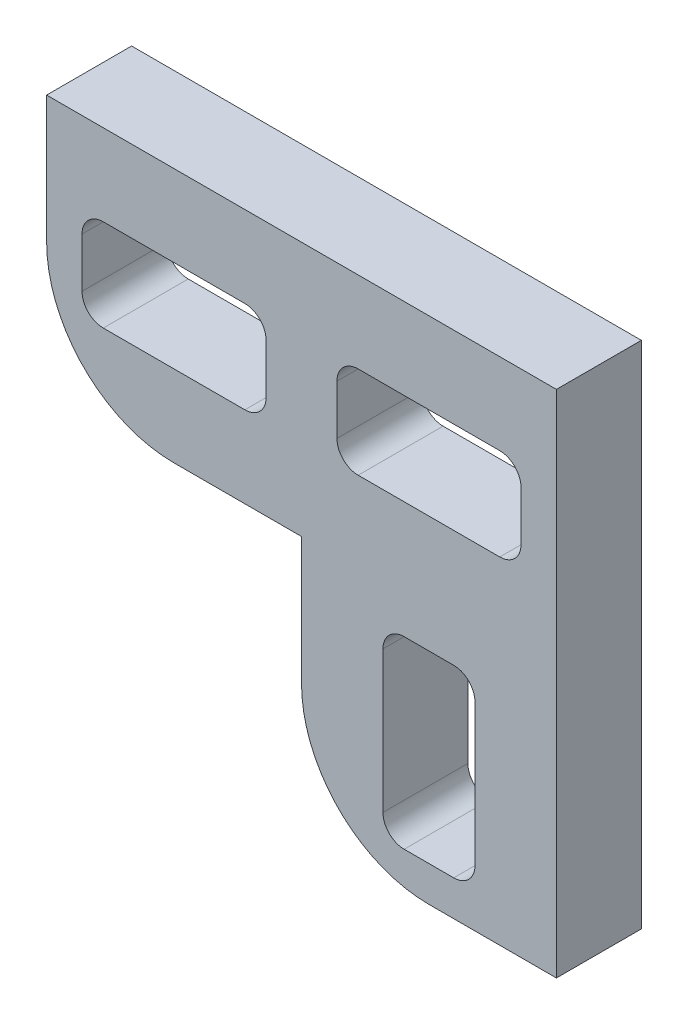
ISO-10303-21;
HEADER;
FILE_DESCRIPTION(('STEP AP214'),'2;1');
FILE_NAME('part.step','',(''),(''),'','','');
FILE_SCHEMA(('AUTOMOTIVE_DESIGN { 1 0 10303 214 1 1 1 1 }'));
ENDSEC;
DATA;
#1=APPLICATION_CONTEXT('core data for automotive mechanical design processes');
#2=APPLICATION_PROTOCOL_DEFINITION('international standard','automotive_design',2000,#1);
#3=PRODUCT_CONTEXT('',#1,'mechanical');
#4=PRODUCT('Part','Part','',(#3));
#5=PRODUCT_RELATED_PRODUCT_CATEGORY('part','',(#4));
#6=PRODUCT_DEFINITION_FORMATION('','',#4);
#7=PRODUCT_DEFINITION_CONTEXT('part definition',#1,'design');
#8=PRODUCT_DEFINITION('design','',#6,#7);
#9=PRODUCT_DEFINITION_SHAPE('','',#8);
#10=(LENGTH_UNIT() NAMED_UNIT(*) SI_UNIT(.MILLI.,.METRE.));
#11=(NAMED_UNIT(*) PLANE_ANGLE_UNIT() SI_UNIT($,.RADIAN.));
#12=(NAMED_UNIT(*) SI_UNIT($,.STERADIAN.) SOLID_ANGLE_UNIT());
#13=UNCERTAINTY_MEASURE_WITH_UNIT(LENGTH_MEASURE(1.E-05),#10,'distance_accuracy_value','');
#14=(GEOMETRIC_REPRESENTATION_CONTEXT(3) GLOBAL_UNCERTAINTY_ASSIGNED_CONTEXT((#13)) GLOBAL_UNIT_ASSIGNED_CONTEXT((#10,
#11,#12)) REPRESENTATION_CONTEXT('',''));
#15=CARTESIAN_POINT('',(0.,0.,0.));
#16=DIRECTION('',(0.,0.,1.));
#17=DIRECTION('',(1.,0.,0.));
#18=AXIS2_PLACEMENT_3D('',#15,#16,#17);
#19=CARTESIAN_POINT('',(149.3421335095,207.323953209,3.));
#20=DIRECTION('',(0.,0.,1.));
#21=DIRECTION('',(1.,0.,0.));
#22=AXIS2_PLACEMENT_3D('',#19,#20,#21);
#23=PLANE('',#22);
#24=DIRECTION('',(1.,0.,0.));
#25=VECTOR('',#24,1.);
#26=CARTESIAN_POINT('',(151.8421335095,205.698953209,3.));
#27=LINE('',#26,#25);
#28=CARTESIAN_POINT('',(146.8421335095,205.698953209,3.));
#29=VERTEX_POINT('',#28);
#30=CARTESIAN_POINT('',(151.8421335095,205.698953209,3.));
#31=VERTEX_POINT('',#30);
#32=EDGE_CURVE('E309',#29,#31,#27,.T.);
#33=ORIENTED_EDGE('',*,*,#32,.F.);
#34=CARTESIAN_POINT('',(146.8421335095,206.448953209,3.));
#35=DIRECTION('',(0.,0.,1.));
#36=DIRECTION('',(1.,0.,0.));
#37=AXIS2_PLACEMENT_3D('',#34,#35,#36);
#38=CIRCLE('',#37,0.750000000000001);
#39=CARTESIAN_POINT('',(146.0921335095,206.448953209,3.));
#40=VERTEX_POINT('',#39);
#41=EDGE_CURVE('E307',#40,#29,#38,.T.);
#42=ORIENTED_EDGE('',*,*,#41,.F.);
#43=DIRECTION('',(0.,-1.,0.));
#44=VECTOR('',#43,1.);
#45=CARTESIAN_POINT('',(146.0921335095,206.448953209,3.));
#46=LINE('',#45,#44);
#47=CARTESIAN_POINT('',(146.0921335095,208.198953209,3.));
#48=VERTEX_POINT('',#47);
#49=EDGE_CURVE('E323',#48,#40,#46,.T.);
#50=ORIENTED_EDGE('',*,*,#49,.F.);
#51=CARTESIAN_POINT('',(146.8421335095,208.198953209,3.));
#52=DIRECTION('',(0.,0.,1.));
#53=DIRECTION('',(1.,0.,0.));
#54=AXIS2_PLACEMENT_3D('',#51,#52,#53);
#55=CIRCLE('',#54,0.750000000000001);
#56=CARTESIAN_POINT('',(146.8421335095,208.948953209,3.));
#57=VERTEX_POINT('',#56);
#58=EDGE_CURVE('E320',#57,#48,#55,.T.);
#59=ORIENTED_EDGE('',*,*,#58,.F.);
#60=DIRECTION('',(-1.,0.,0.));
#61=VECTOR('',#60,1.);
#62=CARTESIAN_POINT('',(146.8421335095,208.948953209,3.));
#63=LINE('',#62,#61);
#64=CARTESIAN_POINT('',(151.8421335095,208.948953209,3.));
#65=VERTEX_POINT('',#64);
#66=EDGE_CURVE('E318',#65,#57,#63,.T.);
#67=ORIENTED_EDGE('',*,*,#66,.F.);
#68=CARTESIAN_POINT('',(151.8421335095,208.198953209,3.));
#69=DIRECTION('',(0.,0.,1.));
#70=DIRECTION('',(1.,0.,0.));
#71=AXIS2_PLACEMENT_3D('',#68,#69,#70);
#72=CIRCLE('',#71,0.750000000000001);
#73=CARTESIAN_POINT('',(152.5921335095,208.198953209,3.));
#74=VERTEX_POINT('',#73);
#75=EDGE_CURVE('E316',#74,#65,#72,.T.);
#76=ORIENTED_EDGE('',*,*,#75,.F.);
#77=DIRECTION('',(0.,1.,0.));
#78=VECTOR('',#77,1.);
#79=CARTESIAN_POINT('',(152.5921335095,208.198953209,3.));
#80=LINE('',#79,#78);
#81=CARTESIAN_POINT('',(152.5921335095,206.448953209,3.));
#82=VERTEX_POINT('',#81);
#83=EDGE_CURVE('E314',#82,#74,#80,.T.);
#84=ORIENTED_EDGE('',*,*,#83,.F.);
#85=CARTESIAN_POINT('',(151.8421335095,206.448953209,3.));
#86=DIRECTION('',(0.,0.,1.));
#87=DIRECTION('',(1.,0.,0.));
#88=AXIS2_PLACEMENT_3D('',#85,#86,#87);
#89=CIRCLE('',#88,0.750000000000001);
#90=EDGE_CURVE('E312',#31,#82,#89,.T.);
#91=ORIENTED_EDGE('',*,*,#90,.F.);
#92=EDGE_LOOP('',(#33,#42,#50,#59,#67,#76,#84,#91));
#93=FACE_BOUND('',#92,.T.);
#94=CARTESIAN_POINT('',(149.3421335095,207.323953209,3.));
#95=DIRECTION('',(0.,0.,1.));
#96=DIRECTION('',(1.,0.,0.));
#97=AXIS2_PLACEMENT_3D('',#94,#95,#96);
#98=CIRCLE('',#97,4.49999999999999);
#99=CARTESIAN_POINT('',(144.8421335095,207.323953209,3.));
#100=VERTEX_POINT('',#99);
#101=CARTESIAN_POINT('',(149.3421335095,202.823953209,3.));
#102=VERTEX_POINT('',#101);
#103=EDGE_CURVE('E425',#100,#102,#98,.T.);
#104=ORIENTED_EDGE('',*,*,#103,.T.);
#105=DIRECTION('',(1.,0.,0.));
#106=VECTOR('',#105,1.);
#107=CARTESIAN_POINT('',(153.8421335095,202.823953209,3.));
#108=LINE('',#107,#106);
#109=CARTESIAN_POINT('',(153.8421335095,202.823953209,3.));
#110=VERTEX_POINT('',#109);
#111=EDGE_CURVE('E428',#102,#110,#108,.T.);
#112=ORIENTED_EDGE('',*,*,#111,.T.);
#113=DIRECTION('',(0.,-1.,0.));
#114=VECTOR('',#113,1.);
#115=CARTESIAN_POINT('',(153.8421335095,198.323953209,3.));
#116=LINE('',#115,#114);
#117=CARTESIAN_POINT('',(153.8421335095,198.323953209,3.));
#118=VERTEX_POINT('',#117);
#119=EDGE_CURVE('E431',#110,#118,#116,.T.);
#120=ORIENTED_EDGE('',*,*,#119,.T.);
#121=CARTESIAN_POINT('',(158.3421335095,198.323953209,3.));
#122=DIRECTION('',(0.,0.,1.));
#123=DIRECTION('',(1.,0.,0.));
#124=AXIS2_PLACEMENT_3D('',#121,#122,#123);
#125=CIRCLE('',#124,4.49999999999999);
#126=CARTESIAN_POINT('',(158.3421335095,193.823953209,3.));
#127=VERTEX_POINT('',#126);
#128=EDGE_CURVE('E433',#118,#127,#125,.T.);
#129=ORIENTED_EDGE('',*,*,#128,.T.);
#130=DIRECTION('',(1.,0.,0.));
#131=VECTOR('',#130,1.);
#132=CARTESIAN_POINT('',(158.3421335095,193.823953209,3.));
#133=LINE('',#132,#131);
#134=CARTESIAN_POINT('',(162.8421335095,193.823953209,3.));
#135=VERTEX_POINT('',#134);
#136=EDGE_CURVE('E435',#127,#135,#133,.T.);
#137=ORIENTED_EDGE('',*,*,#136,.T.);
#138=DIRECTION('',(0.,1.,0.));
#139=VECTOR('',#138,1.);
#140=CARTESIAN_POINT('',(162.8421335095,198.323953209,3.));
#141=LINE('',#140,#139);
#142=CARTESIAN_POINT('',(162.8421335095,211.823953209,3.));
#143=VERTEX_POINT('',#142);
#144=EDGE_CURVE('E437',#135,#143,#141,.T.);
#145=ORIENTED_EDGE('',*,*,#144,.T.);
#146=DIRECTION('',(-1.,0.,0.));
#147=VECTOR('',#146,1.);
#148=CARTESIAN_POINT('',(158.3421335095,211.823953209,3.));
#149=LINE('',#148,#147);
#150=CARTESIAN_POINT('',(144.8421335095,211.823953209,3.));
#151=VERTEX_POINT('',#150);
#152=EDGE_CURVE('E439',#143,#151,#149,.T.);
#153=ORIENTED_EDGE('',*,*,#152,.T.);
#154=DIRECTION('',(0.,-1.,0.));
#155=VECTOR('',#154,1.);
#156=CARTESIAN_POINT('',(144.8421335095,207.323953209,3.));
#157=LINE('',#156,#155);
#158=EDGE_CURVE('E441',#151,#100,#157,.T.);
#159=ORIENTED_EDGE('',*,*,#158,.T.);
#160=EDGE_LOOP('',(#104,#112,#120,#129,#137,#145,#153,#159));
#161=FACE_BOUND('',#160,.T.);
#162=DIRECTION('',(0.,-1.,0.));
#163=VECTOR('',#162,1.);
#164=CARTESIAN_POINT('',(156.7171335095,195.823953209,3.));
#165=LINE('',#164,#163);
#166=CARTESIAN_POINT('',(156.7171335095,200.823953209,3.));
#167=VERTEX_POINT('',#166);
#168=CARTESIAN_POINT('',(156.7171335095,195.823953209,3.));
#169=VERTEX_POINT('',#168);
#170=EDGE_CURVE('E368',#167,#169,#165,.T.);
#171=ORIENTED_EDGE('',*,*,#170,.F.);
#172=CARTESIAN_POINT('',(157.4671335095,200.823953209,3.));
#173=DIRECTION('',(0.,0.,1.));
#174=DIRECTION('',(1.,0.,0.));
#175=AXIS2_PLACEMENT_3D('',#172,#173,#174);
#176=CIRCLE('',#175,0.750000000000001);
#177=CARTESIAN_POINT('',(157.4671335095,201.573953209,3.));
#178=VERTEX_POINT('',#177);
#179=EDGE_CURVE('E366',#178,#167,#176,.T.);
#180=ORIENTED_EDGE('',*,*,#179,.F.);
#181=DIRECTION('',(-1.,0.,0.));
#182=VECTOR('',#181,1.);
#183=CARTESIAN_POINT('',(157.4671335095,201.573953209,3.));
#184=LINE('',#183,#182);
#185=CARTESIAN_POINT('',(159.2171335095,201.573953209,3.));
#186=VERTEX_POINT('',#185);
#187=EDGE_CURVE('E382',#186,#178,#184,.T.);
#188=ORIENTED_EDGE('',*,*,#187,.F.);
#189=CARTESIAN_POINT('',(159.2171335095,200.823953209,3.));
#190=DIRECTION('',(0.,0.,1.));
#191=DIRECTION('',(1.,0.,0.));
#192=AXIS2_PLACEMENT_3D('',#189,#190,#191);
#193=CIRCLE('',#192,0.750000000000001);
#194=CARTESIAN_POINT('',(159.9671335095,200.823953209,3.));
#195=VERTEX_POINT('',#194);
#196=EDGE_CURVE('E379',#195,#186,#193,.T.);
#197=ORIENTED_EDGE('',*,*,#196,.F.);
#198=DIRECTION('',(0.,1.,0.));
#199=VECTOR('',#198,1.);
#200=CARTESIAN_POINT('',(159.9671335095,200.823953209,3.));
#201=LINE('',#200,#199);
#202=CARTESIAN_POINT('',(159.9671335095,195.823953209,3.));
#203=VERTEX_POINT('',#202);
#204=EDGE_CURVE('E377',#203,#195,#201,.T.);
#205=ORIENTED_EDGE('',*,*,#204,.F.);
#206=CARTESIAN_POINT('',(159.2171335095,195.823953209,3.));
#207=DIRECTION('',(0.,0.,1.));
#208=DIRECTION('',(1.,0.,0.));
#209=AXIS2_PLACEMENT_3D('',#206,#207,#208);
#210=CIRCLE('',#209,0.750000000000001);
#211=CARTESIAN_POINT('',(159.2171335095,195.073953209,3.));
#212=VERTEX_POINT('',#211);
#213=EDGE_CURVE('E375',#212,#203,#210,.T.);
#214=ORIENTED_EDGE('',*,*,#213,.F.);
#215=DIRECTION('',(1.,0.,0.));
#216=VECTOR('',#215,1.);
#217=CARTESIAN_POINT('',(159.2171335095,195.073953209,3.));
#218=LINE('',#217,#216);
#219=CARTESIAN_POINT('',(157.4671335095,195.073953209,3.));
#220=VERTEX_POINT('',#219);
#221=EDGE_CURVE('E373',#220,#212,#218,.T.);
#222=ORIENTED_EDGE('',*,*,#221,.F.);
#223=CARTESIAN_POINT('',(157.4671335095,195.823953209,3.));
#224=DIRECTION('',(0.,0.,1.));
#225=DIRECTION('',(1.,0.,0.));
#226=AXIS2_PLACEMENT_3D('',#223,#224,#225);
#227=CIRCLE('',#226,0.750000000000001);
#228=EDGE_CURVE('E371',#169,#220,#227,.T.);
#229=ORIENTED_EDGE('',*,*,#228,.F.);
#230=EDGE_LOOP('',(#171,#180,#188,#197,#205,#214,#222,#229));
#231=FACE_BOUND('',#230,.T.);
#232=DIRECTION('',(1.,0.,0.));
#233=VECTOR('',#232,1.);
#234=CARTESIAN_POINT('',(160.8421335095,205.698953209,3.));
#235=LINE('',#234,#233);
#236=CARTESIAN_POINT('',(155.8421335095,205.698953209,3.));
#237=VERTEX_POINT('',#236);
#238=CARTESIAN_POINT('',(160.8421335095,205.698953209,3.));
#239=VERTEX_POINT('',#238);
#240=EDGE_CURVE('E250',#237,#239,#235,.T.);
#241=ORIENTED_EDGE('',*,*,#240,.F.);
#242=CARTESIAN_POINT('',(155.8421335095,206.448953209,3.));
#243=DIRECTION('',(0.,0.,1.));
#244=DIRECTION('',(1.,0.,0.));
#245=AXIS2_PLACEMENT_3D('',#242,#243,#244);
#246=CIRCLE('',#245,0.749999999999987);
#247=CARTESIAN_POINT('',(155.0921335095,206.448953209,3.));
#248=VERTEX_POINT('',#247);
#249=EDGE_CURVE('E242',#248,#237,#246,.T.);
#250=ORIENTED_EDGE('',*,*,#249,.F.);
#251=DIRECTION('',(0.,-1.,0.));
#252=VECTOR('',#251,1.);
#253=CARTESIAN_POINT('',(155.0921335095,206.448953209,3.));
#254=LINE('',#253,#252);
#255=CARTESIAN_POINT('',(155.0921335095,208.198953209,3.));
#256=VERTEX_POINT('',#255);
#257=EDGE_CURVE('E275',#256,#248,#254,.T.);
#258=ORIENTED_EDGE('',*,*,#257,.F.);
#259=CARTESIAN_POINT('',(155.8421335095,208.198953209,3.));
#260=DIRECTION('',(0.,0.,1.));
#261=DIRECTION('',(1.,0.,0.));
#262=AXIS2_PLACEMENT_3D('',#259,#260,#261);
#263=CIRCLE('',#262,0.749999999999987);
#264=CARTESIAN_POINT('',(155.8421335095,208.948953209,3.));
#265=VERTEX_POINT('',#264);
#266=EDGE_CURVE('E273',#265,#256,#263,.T.);
#267=ORIENTED_EDGE('',*,*,#266,.F.);
#268=DIRECTION('',(-1.,0.,0.));
#269=VECTOR('',#268,1.);
#270=CARTESIAN_POINT('',(155.8421335095,208.948953209,3.));
#271=LINE('',#270,#269);
#272=CARTESIAN_POINT('',(160.8421335095,208.948953209,3.));
#273=VERTEX_POINT('',#272);
#274=EDGE_CURVE('E271',#273,#265,#271,.T.);
#275=ORIENTED_EDGE('',*,*,#274,.F.);
#276=CARTESIAN_POINT('',(160.8421335095,208.198953209,3.));
#277=DIRECTION('',(0.,0.,1.));
#278=DIRECTION('',(1.,0.,0.));
#279=AXIS2_PLACEMENT_3D('',#276,#277,#278);
#280=CIRCLE('',#279,0.750000000000001);
#281=CARTESIAN_POINT('',(161.5921335095,208.198953209,3.));
#282=VERTEX_POINT('',#281);
#283=EDGE_CURVE('E269',#282,#273,#280,.T.);
#284=ORIENTED_EDGE('',*,*,#283,.F.);
#285=DIRECTION('',(0.,1.,0.));
#286=VECTOR('',#285,1.);
#287=CARTESIAN_POINT('',(161.5921335095,208.198953209,3.));
#288=LINE('',#287,#286);
#289=CARTESIAN_POINT('',(161.5921335095,206.448953209,3.));
#290=VERTEX_POINT('',#289);
#291=EDGE_CURVE('E265',#290,#282,#288,.T.);
#292=ORIENTED_EDGE('',*,*,#291,.F.);
#293=CARTESIAN_POINT('',(160.8421335095,206.448953209,3.));
#294=DIRECTION('',(0.,0.,1.));
#295=DIRECTION('',(1.,0.,0.));
#296=AXIS2_PLACEMENT_3D('',#293,#294,#295);
#297=CIRCLE('',#296,0.750000000000001);
#298=EDGE_CURVE('E263',#239,#290,#297,.T.);
#299=ORIENTED_EDGE('',*,*,#298,.F.);
#300=EDGE_LOOP('',(#241,#250,#258,#267,#275,#284,#292,#299));
#301=FACE_BOUND('',#300,.T.);
#302=ADVANCED_FACE('F33',(#93,#161,#231,#301),#23,.T.);
#303=CARTESIAN_POINT('',(149.3421335095,207.323953209,0.));
#304=DIRECTION('',(0.,0.,1.));
#305=DIRECTION('',(1.,0.,0.));
#306=AXIS2_PLACEMENT_3D('',#303,#304,#305);
#307=PLANE('',#306);
#308=CARTESIAN_POINT('',(146.8421335095,206.448953209,0.));
#309=DIRECTION('',(0.,0.,1.));
#310=DIRECTION('',(1.,0.,0.));
#311=AXIS2_PLACEMENT_3D('',#308,#309,#310);
#312=CIRCLE('',#311,0.750000000000001);
#313=CARTESIAN_POINT('',(146.0921335095,206.448953209,0.));
#314=VERTEX_POINT('',#313);
#315=CARTESIAN_POINT('',(146.8421335095,205.698953209,0.));
#316=VERTEX_POINT('',#315);
#317=EDGE_CURVE('E258',#314,#316,#312,.T.);
#318=ORIENTED_EDGE('',*,*,#317,.T.);
#319=DIRECTION('',(1.,0.,0.));
#320=VECTOR('',#319,1.);
#321=CARTESIAN_POINT('',(151.8421335095,205.698953209,0.));
#322=LINE('',#321,#320);
#323=CARTESIAN_POINT('',(151.8421335095,205.698953209,0.));
#324=VERTEX_POINT('',#323);
#325=EDGE_CURVE('E328',#316,#324,#322,.T.);
#326=ORIENTED_EDGE('',*,*,#325,.T.);
#327=CARTESIAN_POINT('',(151.8421335095,206.448953209,0.));
#328=DIRECTION('',(0.,0.,1.));
#329=DIRECTION('',(1.,0.,0.));
#330=AXIS2_PLACEMENT_3D('',#327,#328,#329);
#331=CIRCLE('',#330,0.750000000000001);
#332=CARTESIAN_POINT('',(152.5921335095,206.448953209,0.));
#333=VERTEX_POINT('',#332);
#334=EDGE_CURVE('E331',#324,#333,#331,.T.);
#335=ORIENTED_EDGE('',*,*,#334,.T.);
#336=DIRECTION('',(0.,1.,0.));
#337=VECTOR('',#336,1.);
#338=CARTESIAN_POINT('',(152.5921335095,208.198953209,0.));
#339=LINE('',#338,#337);
#340=CARTESIAN_POINT('',(152.5921335095,208.198953209,0.));
#341=VERTEX_POINT('',#340);
#342=EDGE_CURVE('E334',#333,#341,#339,.T.);
#343=ORIENTED_EDGE('',*,*,#342,.T.);
#344=CARTESIAN_POINT('',(151.8421335095,208.198953209,0.));
#345=DIRECTION('',(0.,0.,1.));
#346=DIRECTION('',(1.,0.,0.));
#347=AXIS2_PLACEMENT_3D('',#344,#345,#346);
#348=CIRCLE('',#347,0.750000000000001);
#349=CARTESIAN_POINT('',(151.8421335095,208.948953209,0.));
#350=VERTEX_POINT('',#349);
#351=EDGE_CURVE('E337',#341,#350,#348,.T.);
#352=ORIENTED_EDGE('',*,*,#351,.T.);
#353=DIRECTION('',(-1.,0.,0.));
#354=VECTOR('',#353,1.);
#355=CARTESIAN_POINT('',(146.8421335095,208.948953209,0.));
#356=LINE('',#355,#354);
#357=CARTESIAN_POINT('',(146.8421335095,208.948953209,0.));
#358=VERTEX_POINT('',#357);
#359=EDGE_CURVE('E340',#350,#358,#356,.T.);
#360=ORIENTED_EDGE('',*,*,#359,.T.);
#361=CARTESIAN_POINT('',(146.8421335095,208.198953209,0.));
#362=DIRECTION('',(0.,0.,1.));
#363=DIRECTION('',(1.,0.,0.));
#364=AXIS2_PLACEMENT_3D('',#361,#362,#363);
#365=CIRCLE('',#364,0.750000000000001);
#366=CARTESIAN_POINT('',(146.0921335095,208.198953209,0.));
#367=VERTEX_POINT('',#366);
#368=EDGE_CURVE('E343',#358,#367,#365,.T.);
#369=ORIENTED_EDGE('',*,*,#368,.T.);
#370=DIRECTION('',(0.,-1.,0.));
#371=VECTOR('',#370,1.);
#372=CARTESIAN_POINT('',(146.0921335095,206.448953209,0.));
#373=LINE('',#372,#371);
#374=EDGE_CURVE('E310',#367,#314,#373,.T.);
#375=ORIENTED_EDGE('',*,*,#374,.T.);
#376=EDGE_LOOP('',(#318,#326,#335,#343,#352,#360,#369,#375));
#377=FACE_BOUND('',#376,.T.);
#378=CARTESIAN_POINT('',(149.3421335095,207.323953209,0.));
#379=DIRECTION('',(0.,0.,1.));
#380=DIRECTION('',(1.,0.,0.));
#381=AXIS2_PLACEMENT_3D('',#378,#379,#380);
#382=CIRCLE('',#381,4.49999999999999);
#383=CARTESIAN_POINT('',(144.8421335095,207.323953209,0.));
#384=VERTEX_POINT('',#383);
#385=CARTESIAN_POINT('',(149.3421335095,202.823953209,0.));
#386=VERTEX_POINT('',#385);
#387=EDGE_CURVE('E424',#384,#386,#382,.T.);
#388=ORIENTED_EDGE('',*,*,#387,.F.);
#389=DIRECTION('',(0.,-1.,0.));
#390=VECTOR('',#389,1.);
#391=CARTESIAN_POINT('',(144.8421335095,207.323953209,0.));
#392=LINE('',#391,#390);
#393=CARTESIAN_POINT('',(144.8421335095,211.823953209,0.));
#394=VERTEX_POINT('',#393);
#395=EDGE_CURVE('E429',#394,#384,#392,.T.);
#396=ORIENTED_EDGE('',*,*,#395,.F.);
#397=DIRECTION('',(-1.,0.,0.));
#398=VECTOR('',#397,1.);
#399=CARTESIAN_POINT('',(149.3421335095,211.823953209,0.));
#400=LINE('',#399,#398);
#401=CARTESIAN_POINT('',(162.8421335095,211.823953209,0.));
#402=VERTEX_POINT('',#401);
#403=EDGE_CURVE('E458',#402,#394,#400,.T.);
#404=ORIENTED_EDGE('',*,*,#403,.F.);
#405=DIRECTION('',(0.,1.,0.));
#406=VECTOR('',#405,1.);
#407=CARTESIAN_POINT('',(162.8421335095,198.323953209,0.));
#408=LINE('',#407,#406);
#409=CARTESIAN_POINT('',(162.8421335095,193.823953209,0.));
#410=VERTEX_POINT('',#409);
#411=EDGE_CURVE('E455',#410,#402,#408,.T.);
#412=ORIENTED_EDGE('',*,*,#411,.F.);
#413=DIRECTION('',(1.,0.,0.));
#414=VECTOR('',#413,1.);
#415=CARTESIAN_POINT('',(158.3421335095,193.823953209,0.));
#416=LINE('',#415,#414);
#417=CARTESIAN_POINT('',(158.3421335095,193.823953209,0.));
#418=VERTEX_POINT('',#417);
#419=EDGE_CURVE('E452',#418,#410,#416,.T.);
#420=ORIENTED_EDGE('',*,*,#419,.F.);
#421=CARTESIAN_POINT('',(158.3421335095,198.323953209,0.));
#422=DIRECTION('',(0.,0.,1.));
#423=DIRECTION('',(1.,0.,0.));
#424=AXIS2_PLACEMENT_3D('',#421,#422,#423);
#425=CIRCLE('',#424,4.49999999999999);
#426=CARTESIAN_POINT('',(153.8421335095,198.323953209,0.));
#427=VERTEX_POINT('',#426);
#428=EDGE_CURVE('E450',#427,#418,#425,.T.);
#429=ORIENTED_EDGE('',*,*,#428,.F.);
#430=DIRECTION('',(0.,-1.,0.));
#431=VECTOR('',#430,1.);
#432=CARTESIAN_POINT('',(153.8421335095,198.323953209,0.));
#433=LINE('',#432,#431);
#434=CARTESIAN_POINT('',(153.8421335095,202.823953209,0.));
#435=VERTEX_POINT('',#434);
#436=EDGE_CURVE('E448',#435,#427,#433,.T.);
#437=ORIENTED_EDGE('',*,*,#436,.F.);
#438=DIRECTION('',(1.,0.,0.));
#439=VECTOR('',#438,1.);
#440=CARTESIAN_POINT('',(153.8421335095,202.823953209,0.));
#441=LINE('',#440,#439);
#442=EDGE_CURVE('E446',#386,#435,#441,.T.);
#443=ORIENTED_EDGE('',*,*,#442,.F.);
#444=EDGE_LOOP('',(#388,#396,#404,#412,#420,#429,#437,#443));
#445=FACE_BOUND('',#444,.T.);
#446=CARTESIAN_POINT('',(157.4671335095,200.823953209,0.));
#447=DIRECTION('',(0.,0.,1.));
#448=DIRECTION('',(1.,0.,0.));
#449=AXIS2_PLACEMENT_3D('',#446,#447,#448);
#450=CIRCLE('',#449,0.750000000000001);
#451=CARTESIAN_POINT('',(157.4671335095,201.573953209,0.));
#452=VERTEX_POINT('',#451);
#453=CARTESIAN_POINT('',(156.7171335095,200.823953209,0.));
#454=VERTEX_POINT('',#453);
#455=EDGE_CURVE('E365',#452,#454,#450,.T.);
#456=ORIENTED_EDGE('',*,*,#455,.T.);
#457=DIRECTION('',(0.,-1.,0.));
#458=VECTOR('',#457,1.);
#459=CARTESIAN_POINT('',(156.7171335095,195.823953209,0.));
#460=LINE('',#459,#458);
#461=CARTESIAN_POINT('',(156.7171335095,195.823953209,0.));
#462=VERTEX_POINT('',#461);
#463=EDGE_CURVE('E387',#454,#462,#460,.T.);
#464=ORIENTED_EDGE('',*,*,#463,.T.);
#465=CARTESIAN_POINT('',(157.4671335095,195.823953209,0.));
#466=DIRECTION('',(0.,0.,1.));
#467=DIRECTION('',(1.,0.,0.));
#468=AXIS2_PLACEMENT_3D('',#465,#466,#467);
#469=CIRCLE('',#468,0.750000000000001);
#470=CARTESIAN_POINT('',(157.4671335095,195.073953209,0.));
#471=VERTEX_POINT('',#470);
#472=EDGE_CURVE('E390',#462,#471,#469,.T.);
#473=ORIENTED_EDGE('',*,*,#472,.T.);
#474=DIRECTION('',(1.,0.,0.));
#475=VECTOR('',#474,1.);
#476=CARTESIAN_POINT('',(159.2171335095,195.073953209,0.));
#477=LINE('',#476,#475);
#478=CARTESIAN_POINT('',(159.2171335095,195.073953209,0.));
#479=VERTEX_POINT('',#478);
#480=EDGE_CURVE('E393',#471,#479,#477,.T.);
#481=ORIENTED_EDGE('',*,*,#480,.T.);
#482=CARTESIAN_POINT('',(159.2171335095,195.823953209,0.));
#483=DIRECTION('',(0.,0.,1.));
#484=DIRECTION('',(1.,0.,0.));
#485=AXIS2_PLACEMENT_3D('',#482,#483,#484);
#486=CIRCLE('',#485,0.750000000000001);
#487=CARTESIAN_POINT('',(159.9671335095,195.823953209,0.));
#488=VERTEX_POINT('',#487);
#489=EDGE_CURVE('E396',#479,#488,#486,.T.);
#490=ORIENTED_EDGE('',*,*,#489,.T.);
#491=DIRECTION('',(0.,1.,0.));
#492=VECTOR('',#491,1.);
#493=CARTESIAN_POINT('',(159.9671335095,200.823953209,0.));
#494=LINE('',#493,#492);
#495=CARTESIAN_POINT('',(159.9671335095,200.823953209,0.));
#496=VERTEX_POINT('',#495);
#497=EDGE_CURVE('E399',#488,#496,#494,.T.);
#498=ORIENTED_EDGE('',*,*,#497,.T.);
#499=CARTESIAN_POINT('',(159.2171335095,200.823953209,0.));
#500=DIRECTION('',(0.,0.,1.));
#501=DIRECTION('',(1.,0.,0.));
#502=AXIS2_PLACEMENT_3D('',#499,#500,#501);
#503=CIRCLE('',#502,0.750000000000001);
#504=CARTESIAN_POINT('',(159.2171335095,201.573953209,0.));
#505=VERTEX_POINT('',#504);
#506=EDGE_CURVE('E402',#496,#505,#503,.T.);
#507=ORIENTED_EDGE('',*,*,#506,.T.);
#508=DIRECTION('',(-1.,0.,0.));
#509=VECTOR('',#508,1.);
#510=CARTESIAN_POINT('',(157.4671335095,201.573953209,0.));
#511=LINE('',#510,#509);
#512=EDGE_CURVE('E369',#505,#452,#511,.T.);
#513=ORIENTED_EDGE('',*,*,#512,.T.);
#514=EDGE_LOOP('',(#456,#464,#473,#481,#490,#498,#507,#513));
#515=FACE_BOUND('',#514,.T.);
#516=CARTESIAN_POINT('',(155.8421335095,206.448953209,0.));
#517=DIRECTION('',(0.,0.,1.));
#518=DIRECTION('',(1.,0.,0.));
#519=AXIS2_PLACEMENT_3D('',#516,#517,#518);
#520=CIRCLE('',#519,0.749999999999987);
#521=CARTESIAN_POINT('',(155.0921335095,206.448953209,0.));
#522=VERTEX_POINT('',#521);
#523=CARTESIAN_POINT('',(155.8421335095,205.698953209,0.));
#524=VERTEX_POINT('',#523);
#525=EDGE_CURVE('E56',#522,#524,#520,.T.);
#526=ORIENTED_EDGE('',*,*,#525,.T.);
#527=DIRECTION('',(1.,0.,0.));
#528=VECTOR('',#527,1.);
#529=CARTESIAN_POINT('',(160.8421335095,205.698953209,0.));
#530=LINE('',#529,#528);
#531=CARTESIAN_POINT('',(160.8421335095,205.698953209,0.));
#532=VERTEX_POINT('',#531);
#533=EDGE_CURVE('E257',#524,#532,#530,.T.);
#534=ORIENTED_EDGE('',*,*,#533,.T.);
#535=CARTESIAN_POINT('',(160.8421335095,206.448953209,0.));
#536=DIRECTION('',(0.,0.,1.));
#537=DIRECTION('',(1.,0.,0.));
#538=AXIS2_PLACEMENT_3D('',#535,#536,#537);
#539=CIRCLE('',#538,0.750000000000001);
#540=CARTESIAN_POINT('',(161.5921335095,206.448953209,0.));
#541=VERTEX_POINT('',#540);
#542=EDGE_CURVE('E279',#532,#541,#539,.T.);
#543=ORIENTED_EDGE('',*,*,#542,.T.);
#544=DIRECTION('',(0.,1.,0.));
#545=VECTOR('',#544,1.);
#546=CARTESIAN_POINT('',(161.5921335095,208.198953209,0.));
#547=LINE('',#546,#545);
#548=CARTESIAN_POINT('',(161.5921335095,208.198953209,0.));
#549=VERTEX_POINT('',#548);
#550=EDGE_CURVE('E282',#541,#549,#547,.T.);
#551=ORIENTED_EDGE('',*,*,#550,.T.);
#552=CARTESIAN_POINT('',(160.8421335095,208.198953209,0.));
#553=DIRECTION('',(0.,0.,1.));
#554=DIRECTION('',(1.,0.,0.));
#555=AXIS2_PLACEMENT_3D('',#552,#553,#554);
#556=CIRCLE('',#555,0.750000000000001);
#557=CARTESIAN_POINT('',(160.8421335095,208.948953209,0.));
#558=VERTEX_POINT('',#557);
#559=EDGE_CURVE('E285',#549,#558,#556,.T.);
#560=ORIENTED_EDGE('',*,*,#559,.T.);
#561=DIRECTION('',(-1.,0.,0.));
#562=VECTOR('',#561,1.);
#563=CARTESIAN_POINT('',(155.8421335095,208.948953209,0.));
#564=LINE('',#563,#562);
#565=CARTESIAN_POINT('',(155.8421335095,208.948953209,0.));
#566=VERTEX_POINT('',#565);
#567=EDGE_CURVE('E288',#558,#566,#564,.T.);
#568=ORIENTED_EDGE('',*,*,#567,.T.);
#569=CARTESIAN_POINT('',(155.8421335095,208.198953209,0.));
#570=DIRECTION('',(0.,0.,1.));
#571=DIRECTION('',(1.,0.,0.));
#572=AXIS2_PLACEMENT_3D('',#569,#570,#571);
#573=CIRCLE('',#572,0.749999999999987);
#574=CARTESIAN_POINT('',(155.0921335095,208.198953209,0.));
#575=VERTEX_POINT('',#574);
#576=EDGE_CURVE('E291',#566,#575,#573,.T.);
#577=ORIENTED_EDGE('',*,*,#576,.T.);
#578=DIRECTION('',(0.,-1.,0.));
#579=VECTOR('',#578,1.);
#580=CARTESIAN_POINT('',(155.0921335095,206.448953209,0.));
#581=LINE('',#580,#579);
#582=EDGE_CURVE('E251',#575,#522,#581,.T.);
#583=ORIENTED_EDGE('',*,*,#582,.T.);
#584=EDGE_LOOP('',(#526,#534,#543,#551,#560,#568,#577,#583));
#585=FACE_BOUND('',#584,.T.);
#586=ADVANCED_FACE('F488',(#377,#445,#515,#585),#307,.F.);
#587=CARTESIAN_POINT('',(149.3421335095,207.323953209,3.));
#588=DIRECTION('',(0.,0.,-1.));
#589=DIRECTION('',(-1.,0.,0.));
#590=AXIS2_PLACEMENT_3D('',#587,#588,#589);
#591=CYLINDRICAL_SURFACE('',#590,4.49999999999999);
#592=ORIENTED_EDGE('',*,*,#387,.T.);
#593=DIRECTION('',(0.,0.,-1.));
#594=VECTOR('',#593,1.);
#595=CARTESIAN_POINT('',(149.3421335095,202.823953209,3.));
#596=LINE('',#595,#594);
#597=EDGE_CURVE('E11',#102,#386,#596,.T.);
#598=ORIENTED_EDGE('',*,*,#597,.F.);
#599=ORIENTED_EDGE('',*,*,#103,.F.);
#600=DIRECTION('',(0.,0.,-1.));
#601=VECTOR('',#600,1.);
#602=CARTESIAN_POINT('',(144.8421335095,207.323953209,3.));
#603=LINE('',#602,#601);
#604=EDGE_CURVE('E443',#100,#384,#603,.T.);
#605=ORIENTED_EDGE('',*,*,#604,.T.);
#606=EDGE_LOOP('',(#592,#598,#599,#605));
#607=FACE_BOUND('',#606,.T.);
#608=ADVANCED_FACE('F35',(#607),#591,.T.);
#609=CARTESIAN_POINT('',(153.8421335095,202.823953209,3.));
#610=DIRECTION('',(0.,1.,0.));
#611=DIRECTION('',(0.,0.,1.));
#612=AXIS2_PLACEMENT_3D('',#609,#610,#611);
#613=PLANE('',#612);
#614=ORIENTED_EDGE('',*,*,#442,.T.);
#615=DIRECTION('',(0.,0.,-1.));
#616=VECTOR('',#615,1.);
#617=CARTESIAN_POINT('',(153.8421335095,202.823953209,3.));
#618=LINE('',#617,#616);
#619=EDGE_CURVE('E41',#110,#435,#618,.T.);
#620=ORIENTED_EDGE('',*,*,#619,.F.);
#621=ORIENTED_EDGE('',*,*,#111,.F.);
#622=ORIENTED_EDGE('',*,*,#597,.T.);
#623=EDGE_LOOP('',(#614,#620,#621,#622));
#624=FACE_BOUND('',#623,.T.);
#625=ADVANCED_FACE('F505',(#624),#613,.F.);
#626=CARTESIAN_POINT('',(153.8421335095,198.323953209,3.));
#627=DIRECTION('',(1.,0.,0.));
#628=DIRECTION('',(0.,0.,-1.));
#629=AXIS2_PLACEMENT_3D('',#626,#627,#628);
#630=PLANE('',#629);
#631=ORIENTED_EDGE('',*,*,#436,.T.);
#632=DIRECTION('',(0.,0.,-1.));
#633=VECTOR('',#632,1.);
#634=CARTESIAN_POINT('',(153.8421335095,198.323953209,3.));
#635=LINE('',#634,#633);
#636=EDGE_CURVE('E475',#118,#427,#635,.T.);
#637=ORIENTED_EDGE('',*,*,#636,.F.);
#638=ORIENTED_EDGE('',*,*,#119,.F.);
#639=ORIENTED_EDGE('',*,*,#619,.T.);
#640=EDGE_LOOP('',(#631,#637,#638,#639));
#641=FACE_BOUND('',#640,.T.);
#642=ADVANCED_FACE('F482',(#641),#630,.F.);
#643=CARTESIAN_POINT('',(158.3421335095,198.323953209,3.));
#644=DIRECTION('',(0.,0.,-1.));
#645=DIRECTION('',(-1.,0.,0.));
#646=AXIS2_PLACEMENT_3D('',#643,#644,#645);
#647=CYLINDRICAL_SURFACE('',#646,4.49999999999999);
#648=ORIENTED_EDGE('',*,*,#428,.T.);
#649=DIRECTION('',(0.,0.,-1.));
#650=VECTOR('',#649,1.);
#651=CARTESIAN_POINT('',(158.3421335095,193.823953209,3.));
#652=LINE('',#651,#650);
#653=EDGE_CURVE('E472',#127,#418,#652,.T.);
#654=ORIENTED_EDGE('',*,*,#653,.F.);
#655=ORIENTED_EDGE('',*,*,#128,.F.);
#656=ORIENTED_EDGE('',*,*,#636,.T.);
#657=EDGE_LOOP('',(#648,#654,#655,#656));
#658=FACE_BOUND('',#657,.T.);
#659=ADVANCED_FACE('F493',(#658),#647,.T.);
#660=CARTESIAN_POINT('',(158.3421335095,193.823953209,3.));
#661=DIRECTION('',(0.,1.,0.));
#662=DIRECTION('',(0.,0.,1.));
#663=AXIS2_PLACEMENT_3D('',#660,#661,#662);
#664=PLANE('',#663);
#665=ORIENTED_EDGE('',*,*,#419,.T.);
#666=DIRECTION('',(0.,0.,-1.));
#667=VECTOR('',#666,1.);
#668=CARTESIAN_POINT('',(162.8421335095,193.823953209,3.));
#669=LINE('',#668,#667);
#670=EDGE_CURVE('E469',#135,#410,#669,.T.);
#671=ORIENTED_EDGE('',*,*,#670,.F.);
#672=ORIENTED_EDGE('',*,*,#136,.F.);
#673=ORIENTED_EDGE('',*,*,#653,.T.);
#674=EDGE_LOOP('',(#665,#671,#672,#673));
#675=FACE_BOUND('',#674,.T.);
#676=ADVANCED_FACE('F497',(#675),#664,.F.);
#677=CARTESIAN_POINT('',(162.8421335095,198.323953209,3.));
#678=DIRECTION('',(-1.,0.,0.));
#679=DIRECTION('',(0.,0.,1.));
#680=AXIS2_PLACEMENT_3D('',#677,#678,#679);
#681=PLANE('',#680);
#682=ORIENTED_EDGE('',*,*,#411,.T.);
#683=DIRECTION('',(0.,0.,-1.));
#684=VECTOR('',#683,1.);
#685=CARTESIAN_POINT('',(162.8421335095,211.823953209,3.));
#686=LINE('',#685,#684);
#687=EDGE_CURVE('E466',#143,#402,#686,.T.);
#688=ORIENTED_EDGE('',*,*,#687,.F.);
#689=ORIENTED_EDGE('',*,*,#144,.F.);
#690=ORIENTED_EDGE('',*,*,#670,.T.);
#691=EDGE_LOOP('',(#682,#688,#689,#690));
#692=FACE_BOUND('',#691,.T.);
#693=ADVANCED_FACE('F517',(#692),#681,.F.);
#694=CARTESIAN_POINT('',(149.3421335095,211.823953209,3.));
#695=DIRECTION('',(0.,-1.,0.));
#696=DIRECTION('',(0.,0.,-1.));
#697=AXIS2_PLACEMENT_3D('',#694,#695,#696);
#698=PLANE('',#697);
#699=ORIENTED_EDGE('',*,*,#403,.T.);
#700=DIRECTION('',(0.,0.,-1.));
#701=VECTOR('',#700,1.);
#702=CARTESIAN_POINT('',(144.8421335095,211.823953209,3.));
#703=LINE('',#702,#701);
#704=EDGE_CURVE('E463',#151,#394,#703,.T.);
#705=ORIENTED_EDGE('',*,*,#704,.F.);
#706=ORIENTED_EDGE('',*,*,#152,.F.);
#707=ORIENTED_EDGE('',*,*,#687,.T.);
#708=EDGE_LOOP('',(#699,#705,#706,#707));
#709=FACE_BOUND('',#708,.T.);
#710=ADVANCED_FACE('F515',(#709),#698,.F.);
#711=CARTESIAN_POINT('',(144.8421335095,207.323953209,3.));
#712=DIRECTION('',(1.,0.,0.));
#713=DIRECTION('',(0.,0.,-1.));
#714=AXIS2_PLACEMENT_3D('',#711,#712,#713);
#715=PLANE('',#714);
#716=ORIENTED_EDGE('',*,*,#395,.T.);
#717=ORIENTED_EDGE('',*,*,#604,.F.);
#718=ORIENTED_EDGE('',*,*,#158,.F.);
#719=ORIENTED_EDGE('',*,*,#704,.T.);
#720=EDGE_LOOP('',(#716,#717,#718,#719));
#721=FACE_BOUND('',#720,.T.);
#722=ADVANCED_FACE('F510',(#721),#715,.F.);
#723=CARTESIAN_POINT('',(157.4671335095,200.823953209,3.));
#724=DIRECTION('',(0.,0.,-1.));
#725=DIRECTION('',(-1.,0.,0.));
#726=AXIS2_PLACEMENT_3D('',#723,#724,#725);
#727=CYLINDRICAL_SURFACE('',#726,0.750000000000001);
#728=ORIENTED_EDGE('',*,*,#455,.F.);
#729=DIRECTION('',(0.,0.,-1.));
#730=VECTOR('',#729,1.);
#731=CARTESIAN_POINT('',(157.4671335095,201.573953209,3.));
#732=LINE('',#731,#730);
#733=EDGE_CURVE('E384',#178,#452,#732,.T.);
#734=ORIENTED_EDGE('',*,*,#733,.F.);
#735=ORIENTED_EDGE('',*,*,#179,.T.);
#736=DIRECTION('',(0.,0.,-1.));
#737=VECTOR('',#736,1.);
#738=CARTESIAN_POINT('',(156.7171335095,200.823953209,3.));
#739=LINE('',#738,#737);
#740=EDGE_CURVE('E421',#167,#454,#739,.T.);
#741=ORIENTED_EDGE('',*,*,#740,.T.);
#742=EDGE_LOOP('',(#728,#734,#735,#741));
#743=FACE_BOUND('',#742,.T.);
#744=ADVANCED_FACE('F536',(#743),#727,.F.);
#745=CARTESIAN_POINT('',(156.7171335095,195.823953209,3.));
#746=DIRECTION('',(1.,0.,0.));
#747=DIRECTION('',(0.,0.,-1.));
#748=AXIS2_PLACEMENT_3D('',#745,#746,#747);
#749=PLANE('',#748);
#750=ORIENTED_EDGE('',*,*,#463,.F.);
#751=ORIENTED_EDGE('',*,*,#740,.F.);
#752=ORIENTED_EDGE('',*,*,#170,.T.);
#753=DIRECTION('',(0.,0.,-1.));
#754=VECTOR('',#753,1.);
#755=CARTESIAN_POINT('',(156.7171335095,195.823953209,3.));
#756=LINE('',#755,#754);
#757=EDGE_CURVE('E419',#169,#462,#756,.T.);
#758=ORIENTED_EDGE('',*,*,#757,.T.);
#759=EDGE_LOOP('',(#750,#751,#752,#758));
#760=FACE_BOUND('',#759,.T.);
#761=ADVANCED_FACE('F543',(#760),#749,.T.);
#762=CARTESIAN_POINT('',(157.4671335095,195.823953209,3.));
#763=DIRECTION('',(0.,0.,-1.));
#764=DIRECTION('',(-1.,0.,0.));
#765=AXIS2_PLACEMENT_3D('',#762,#763,#764);
#766=CYLINDRICAL_SURFACE('',#765,0.750000000000001);
#767=ORIENTED_EDGE('',*,*,#472,.F.);
#768=ORIENTED_EDGE('',*,*,#757,.F.);
#769=ORIENTED_EDGE('',*,*,#228,.T.);
#770=DIRECTION('',(0.,0.,-1.));
#771=VECTOR('',#770,1.);
#772=CARTESIAN_POINT('',(157.4671335095,195.073953209,3.));
#773=LINE('',#772,#771);
#774=EDGE_CURVE('E417',#220,#471,#773,.T.);
#775=ORIENTED_EDGE('',*,*,#774,.T.);
#776=EDGE_LOOP('',(#767,#768,#769,#775));
#777=FACE_BOUND('',#776,.T.);
#778=ADVANCED_FACE('F548',(#777),#766,.F.);
#779=CARTESIAN_POINT('',(159.2171335095,195.073953209,3.));
#780=DIRECTION('',(0.,1.,0.));
#781=DIRECTION('',(0.,0.,1.));
#782=AXIS2_PLACEMENT_3D('',#779,#780,#781);
#783=PLANE('',#782);
#784=ORIENTED_EDGE('',*,*,#480,.F.);
#785=ORIENTED_EDGE('',*,*,#774,.F.);
#786=ORIENTED_EDGE('',*,*,#221,.T.);
#787=DIRECTION('',(0.,0.,-1.));
#788=VECTOR('',#787,1.);
#789=CARTESIAN_POINT('',(159.2171335095,195.073953209,3.));
#790=LINE('',#789,#788);
#791=EDGE_CURVE('E415',#212,#479,#790,.T.);
#792=ORIENTED_EDGE('',*,*,#791,.T.);
#793=EDGE_LOOP('',(#784,#785,#786,#792));
#794=FACE_BOUND('',#793,.T.);
#795=ADVANCED_FACE('F574',(#794),#783,.T.);
#796=CARTESIAN_POINT('',(159.2171335095,195.823953209,3.));
#797=DIRECTION('',(0.,0.,-1.));
#798=DIRECTION('',(-1.,0.,0.));
#799=AXIS2_PLACEMENT_3D('',#796,#797,#798);
#800=CYLINDRICAL_SURFACE('',#799,0.750000000000001);
#801=ORIENTED_EDGE('',*,*,#489,.F.);
#802=ORIENTED_EDGE('',*,*,#791,.F.);
#803=ORIENTED_EDGE('',*,*,#213,.T.);
#804=DIRECTION('',(0.,0.,-1.));
#805=VECTOR('',#804,1.);
#806=CARTESIAN_POINT('',(159.9671335095,195.823953209,3.));
#807=LINE('',#806,#805);
#808=EDGE_CURVE('E413',#203,#488,#807,.T.);
#809=ORIENTED_EDGE('',*,*,#808,.T.);
#810=EDGE_LOOP('',(#801,#802,#803,#809));
#811=FACE_BOUND('',#810,.T.);
#812=ADVANCED_FACE('F579',(#811),#800,.F.);
#813=CARTESIAN_POINT('',(159.9671335095,200.823953209,3.));
#814=DIRECTION('',(-1.,0.,0.));
#815=DIRECTION('',(0.,0.,1.));
#816=AXIS2_PLACEMENT_3D('',#813,#814,#815);
#817=PLANE('',#816);
#818=ORIENTED_EDGE('',*,*,#497,.F.);
#819=ORIENTED_EDGE('',*,*,#808,.F.);
#820=ORIENTED_EDGE('',*,*,#204,.T.);
#821=DIRECTION('',(0.,0.,-1.));
#822=VECTOR('',#821,1.);
#823=CARTESIAN_POINT('',(159.9671335095,200.823953209,3.));
#824=LINE('',#823,#822);
#825=EDGE_CURVE('E411',#195,#496,#824,.T.);
#826=ORIENTED_EDGE('',*,*,#825,.T.);
#827=EDGE_LOOP('',(#818,#819,#820,#826));
#828=FACE_BOUND('',#827,.T.);
#829=ADVANCED_FACE('F582',(#828),#817,.T.);
#830=CARTESIAN_POINT('',(159.2171335095,200.823953209,3.));
#831=DIRECTION('',(0.,0.,-1.));
#832=DIRECTION('',(-1.,0.,0.));
#833=AXIS2_PLACEMENT_3D('',#830,#831,#832);
#834=CYLINDRICAL_SURFACE('',#833,0.750000000000001);
#835=ORIENTED_EDGE('',*,*,#506,.F.);
#836=ORIENTED_EDGE('',*,*,#825,.F.);
#837=ORIENTED_EDGE('',*,*,#196,.T.);
#838=DIRECTION('',(0.,0.,-1.));
#839=VECTOR('',#838,1.);
#840=CARTESIAN_POINT('',(159.2171335095,201.573953209,3.));
#841=LINE('',#840,#839);
#842=EDGE_CURVE('E409',#186,#505,#841,.T.);
#843=ORIENTED_EDGE('',*,*,#842,.T.);
#844=EDGE_LOOP('',(#835,#836,#837,#843));
#845=FACE_BOUND('',#844,.T.);
#846=ADVANCED_FACE('F562',(#845),#834,.F.);
#847=CARTESIAN_POINT('',(157.4671335095,201.573953209,3.));
#848=DIRECTION('',(0.,-1.,0.));
#849=DIRECTION('',(0.,0.,-1.));
#850=AXIS2_PLACEMENT_3D('',#847,#848,#849);
#851=PLANE('',#850);
#852=ORIENTED_EDGE('',*,*,#512,.F.);
#853=ORIENTED_EDGE('',*,*,#842,.F.);
#854=ORIENTED_EDGE('',*,*,#187,.T.);
#855=ORIENTED_EDGE('',*,*,#733,.T.);
#856=EDGE_LOOP('',(#852,#853,#854,#855));
#857=FACE_BOUND('',#856,.T.);
#858=ADVANCED_FACE('F555',(#857),#851,.T.);
#859=CARTESIAN_POINT('',(146.8421335095,206.448953209,3.));
#860=DIRECTION('',(0.,0.,-1.));
#861=DIRECTION('',(-1.,0.,0.));
#862=AXIS2_PLACEMENT_3D('',#859,#860,#861);
#863=CYLINDRICAL_SURFACE('',#862,0.750000000000001);
#864=ORIENTED_EDGE('',*,*,#317,.F.);
#865=DIRECTION('',(0.,0.,-1.));
#866=VECTOR('',#865,1.);
#867=CARTESIAN_POINT('',(146.0921335095,206.448953209,3.));
#868=LINE('',#867,#866);
#869=EDGE_CURVE('E325',#40,#314,#868,.T.);
#870=ORIENTED_EDGE('',*,*,#869,.F.);
#871=ORIENTED_EDGE('',*,*,#41,.T.);
#872=DIRECTION('',(0.,0.,-1.));
#873=VECTOR('',#872,1.);
#874=CARTESIAN_POINT('',(146.8421335095,205.698953209,3.));
#875=LINE('',#874,#873);
#876=EDGE_CURVE('E362',#29,#316,#875,.T.);
#877=ORIENTED_EDGE('',*,*,#876,.T.);
#878=EDGE_LOOP('',(#864,#870,#871,#877));
#879=FACE_BOUND('',#878,.T.);
#880=ADVANCED_FACE('F627',(#879),#863,.F.);
#881=CARTESIAN_POINT('',(151.8421335095,205.698953209,3.));
#882=DIRECTION('',(0.,1.,0.));
#883=DIRECTION('',(0.,0.,1.));
#884=AXIS2_PLACEMENT_3D('',#881,#882,#883);
#885=PLANE('',#884);
#886=ORIENTED_EDGE('',*,*,#325,.F.);
#887=ORIENTED_EDGE('',*,*,#876,.F.);
#888=ORIENTED_EDGE('',*,*,#32,.T.);
#889=DIRECTION('',(0.,0.,-1.));
#890=VECTOR('',#889,1.);
#891=CARTESIAN_POINT('',(151.8421335095,205.698953209,3.));
#892=LINE('',#891,#890);
#893=EDGE_CURVE('E360',#31,#324,#892,.T.);
#894=ORIENTED_EDGE('',*,*,#893,.T.);
#895=EDGE_LOOP('',(#886,#887,#888,#894));
#896=FACE_BOUND('',#895,.T.);
#897=ADVANCED_FACE('F635',(#896),#885,.T.);
#898=CARTESIAN_POINT('',(151.8421335095,206.448953209,3.));
#899=DIRECTION('',(0.,0.,-1.));
#900=DIRECTION('',(-1.,0.,0.));
#901=AXIS2_PLACEMENT_3D('',#898,#899,#900);
#902=CYLINDRICAL_SURFACE('',#901,0.750000000000001);
#903=ORIENTED_EDGE('',*,*,#334,.F.);
#904=ORIENTED_EDGE('',*,*,#893,.F.);
#905=ORIENTED_EDGE('',*,*,#90,.T.);
#906=DIRECTION('',(0.,0.,-1.));
#907=VECTOR('',#906,1.);
#908=CARTESIAN_POINT('',(152.5921335095,206.448953209,3.));
#909=LINE('',#908,#907);
#910=EDGE_CURVE('E358',#82,#333,#909,.T.);
#911=ORIENTED_EDGE('',*,*,#910,.T.);
#912=EDGE_LOOP('',(#903,#904,#905,#911));
#913=FACE_BOUND('',#912,.T.);
#914=ADVANCED_FACE('F645',(#913),#902,.F.);
#915=CARTESIAN_POINT('',(152.5921335095,208.198953209,3.));
#916=DIRECTION('',(-1.,0.,0.));
#917=DIRECTION('',(0.,0.,1.));
#918=AXIS2_PLACEMENT_3D('',#915,#916,#917);
#919=PLANE('',#918);
#920=ORIENTED_EDGE('',*,*,#342,.F.);
#921=ORIENTED_EDGE('',*,*,#910,.F.);
#922=ORIENTED_EDGE('',*,*,#83,.T.);
#923=DIRECTION('',(0.,0.,-1.));
#924=VECTOR('',#923,1.);
#925=CARTESIAN_POINT('',(152.5921335095,208.198953209,3.));
#926=LINE('',#925,#924);
#927=EDGE_CURVE('E356',#74,#341,#926,.T.);
#928=ORIENTED_EDGE('',*,*,#927,.T.);
#929=EDGE_LOOP('',(#920,#921,#922,#928));
#930=FACE_BOUND('',#929,.T.);
#931=ADVANCED_FACE('F655',(#930),#919,.T.);
#932=CARTESIAN_POINT('',(151.8421335095,208.198953209,3.));
#933=DIRECTION('',(0.,0.,-1.));
#934=DIRECTION('',(-1.,0.,0.));
#935=AXIS2_PLACEMENT_3D('',#932,#933,#934);
#936=CYLINDRICAL_SURFACE('',#935,0.750000000000001);
#937=ORIENTED_EDGE('',*,*,#351,.F.);
#938=ORIENTED_EDGE('',*,*,#927,.F.);
#939=ORIENTED_EDGE('',*,*,#75,.T.);
#940=DIRECTION('',(0.,0.,-1.));
#941=VECTOR('',#940,1.);
#942=CARTESIAN_POINT('',(151.8421335095,208.948953209,3.));
#943=LINE('',#942,#941);
#944=EDGE_CURVE('E354',#65,#350,#943,.T.);
#945=ORIENTED_EDGE('',*,*,#944,.T.);
#946=EDGE_LOOP('',(#937,#938,#939,#945));
#947=FACE_BOUND('',#946,.T.);
#948=ADVANCED_FACE('F665',(#947),#936,.F.);
#949=CARTESIAN_POINT('',(146.8421335095,208.948953209,3.));
#950=DIRECTION('',(0.,-1.,0.));
#951=DIRECTION('',(0.,0.,-1.));
#952=AXIS2_PLACEMENT_3D('',#949,#950,#951);
#953=PLANE('',#952);
#954=ORIENTED_EDGE('',*,*,#359,.F.);
#955=ORIENTED_EDGE('',*,*,#944,.F.);
#956=ORIENTED_EDGE('',*,*,#66,.T.);
#957=DIRECTION('',(0.,0.,-1.));
#958=VECTOR('',#957,1.);
#959=CARTESIAN_POINT('',(146.8421335095,208.948953209,3.));
#960=LINE('',#959,#958);
#961=EDGE_CURVE('E352',#57,#358,#960,.T.);
#962=ORIENTED_EDGE('',*,*,#961,.T.);
#963=EDGE_LOOP('',(#954,#955,#956,#962));
#964=FACE_BOUND('',#963,.T.);
#965=ADVANCED_FACE('F675',(#964),#953,.T.);
#966=CARTESIAN_POINT('',(146.8421335095,208.198953209,3.));
#967=DIRECTION('',(0.,0.,-1.));
#968=DIRECTION('',(-1.,0.,0.));
#969=AXIS2_PLACEMENT_3D('',#966,#967,#968);
#970=CYLINDRICAL_SURFACE('',#969,0.750000000000001);
#971=ORIENTED_EDGE('',*,*,#368,.F.);
#972=ORIENTED_EDGE('',*,*,#961,.F.);
#973=ORIENTED_EDGE('',*,*,#58,.T.);
#974=DIRECTION('',(0.,0.,-1.));
#975=VECTOR('',#974,1.);
#976=CARTESIAN_POINT('',(146.0921335095,208.198953209,3.));
#977=LINE('',#976,#975);
#978=EDGE_CURVE('E350',#48,#367,#977,.T.);
#979=ORIENTED_EDGE('',*,*,#978,.T.);
#980=EDGE_LOOP('',(#971,#972,#973,#979));
#981=FACE_BOUND('',#980,.T.);
#982=ADVANCED_FACE('F685',(#981),#970,.F.);
#983=CARTESIAN_POINT('',(146.0921335095,206.448953209,3.));
#984=DIRECTION('',(1.,0.,0.));
#985=DIRECTION('',(0.,0.,-1.));
#986=AXIS2_PLACEMENT_3D('',#983,#984,#985);
#987=PLANE('',#986);
#988=ORIENTED_EDGE('',*,*,#374,.F.);
#989=ORIENTED_EDGE('',*,*,#978,.F.);
#990=ORIENTED_EDGE('',*,*,#49,.T.);
#991=ORIENTED_EDGE('',*,*,#869,.T.);
#992=EDGE_LOOP('',(#988,#989,#990,#991));
#993=FACE_BOUND('',#992,.T.);
#994=ADVANCED_FACE('F695',(#993),#987,.T.);
#995=CARTESIAN_POINT('',(155.8421335095,206.448953209,3.));
#996=DIRECTION('',(0.,0.,-1.));
#997=DIRECTION('',(-1.,0.,0.));
#998=AXIS2_PLACEMENT_3D('',#995,#996,#997);
#999=CYLINDRICAL_SURFACE('',#998,0.749999999999987);
#1000=ORIENTED_EDGE('',*,*,#525,.F.);
#1001=DIRECTION('',(0.,0.,-1.));
#1002=VECTOR('',#1001,1.);
#1003=CARTESIAN_POINT('',(155.0921335095,206.448953209,3.));
#1004=LINE('',#1003,#1002);
#1005=EDGE_CURVE('E246',#248,#522,#1004,.T.);
#1006=ORIENTED_EDGE('',*,*,#1005,.F.);
#1007=ORIENTED_EDGE('',*,*,#249,.T.);
#1008=DIRECTION('',(0.,0.,-1.));
#1009=VECTOR('',#1008,1.);
#1010=CARTESIAN_POINT('',(155.8421335095,205.698953209,3.));
#1011=LINE('',#1010,#1009);
#1012=EDGE_CURVE('E245',#237,#524,#1011,.T.);
#1013=ORIENTED_EDGE('',*,*,#1012,.T.);
#1014=EDGE_LOOP('',(#1000,#1006,#1007,#1013));
#1015=FACE_BOUND('',#1014,.T.);
#1016=ADVANCED_FACE('F244',(#1015),#999,.F.);
#1017=CARTESIAN_POINT('',(160.8421335095,205.698953209,3.));
#1018=DIRECTION('',(0.,1.,0.));
#1019=DIRECTION('',(0.,0.,1.));
#1020=AXIS2_PLACEMENT_3D('',#1017,#1018,#1019);
#1021=PLANE('',#1020);
#1022=ORIENTED_EDGE('',*,*,#533,.F.);
#1023=ORIENTED_EDGE('',*,*,#1012,.F.);
#1024=ORIENTED_EDGE('',*,*,#240,.T.);
#1025=DIRECTION('',(0.,0.,-1.));
#1026=VECTOR('',#1025,1.);
#1027=CARTESIAN_POINT('',(160.8421335095,205.698953209,3.));
#1028=LINE('',#1027,#1026);
#1029=EDGE_CURVE('E259',#239,#532,#1028,.T.);
#1030=ORIENTED_EDGE('',*,*,#1029,.T.);
#1031=EDGE_LOOP('',(#1022,#1023,#1024,#1030));
#1032=FACE_BOUND('',#1031,.T.);
#1033=ADVANCED_FACE('F254',(#1032),#1021,.T.);
#1034=CARTESIAN_POINT('',(160.8421335095,206.448953209,3.));
#1035=DIRECTION('',(0.,0.,-1.));
#1036=DIRECTION('',(-1.,0.,0.));
#1037=AXIS2_PLACEMENT_3D('',#1034,#1035,#1036);
#1038=CYLINDRICAL_SURFACE('',#1037,0.750000000000001);
#1039=ORIENTED_EDGE('',*,*,#542,.F.);
#1040=ORIENTED_EDGE('',*,*,#1029,.F.);
#1041=ORIENTED_EDGE('',*,*,#298,.T.);
#1042=DIRECTION('',(0.,0.,-1.));
#1043=VECTOR('',#1042,1.);
#1044=CARTESIAN_POINT('',(161.5921335095,206.448953209,3.));
#1045=LINE('',#1044,#1043);
#1046=EDGE_CURVE('E304',#290,#541,#1045,.T.);
#1047=ORIENTED_EDGE('',*,*,#1046,.T.);
#1048=EDGE_LOOP('',(#1039,#1040,#1041,#1047));
#1049=FACE_BOUND('',#1048,.T.);
#1050=ADVANCED_FACE('F722',(#1049),#1038,.F.);
#1051=CARTESIAN_POINT('',(161.5921335095,208.198953209,3.));
#1052=DIRECTION('',(-1.,0.,0.));
#1053=DIRECTION('',(0.,0.,1.));
#1054=AXIS2_PLACEMENT_3D('',#1051,#1052,#1053);
#1055=PLANE('',#1054);
#1056=ORIENTED_EDGE('',*,*,#550,.F.);
#1057=ORIENTED_EDGE('',*,*,#1046,.F.);
#1058=ORIENTED_EDGE('',*,*,#291,.T.);
#1059=DIRECTION('',(0.,0.,-1.));
#1060=VECTOR('',#1059,1.);
#1061=CARTESIAN_POINT('',(161.5921335095,208.198953209,3.));
#1062=LINE('',#1061,#1060);
#1063=EDGE_CURVE('E302',#282,#549,#1062,.T.);
#1064=ORIENTED_EDGE('',*,*,#1063,.T.);
#1065=EDGE_LOOP('',(#1056,#1057,#1058,#1064));
#1066=FACE_BOUND('',#1065,.T.);
#1067=ADVANCED_FACE('F731',(#1066),#1055,.T.);
#1068=CARTESIAN_POINT('',(160.8421335095,208.198953209,3.));
#1069=DIRECTION('',(0.,0.,-1.));
#1070=DIRECTION('',(-1.,0.,0.));
#1071=AXIS2_PLACEMENT_3D('',#1068,#1069,#1070);
#1072=CYLINDRICAL_SURFACE('',#1071,0.750000000000001);
#1073=ORIENTED_EDGE('',*,*,#559,.F.);
#1074=ORIENTED_EDGE('',*,*,#1063,.F.);
#1075=ORIENTED_EDGE('',*,*,#283,.T.);
#1076=DIRECTION('',(0.,0.,-1.));
#1077=VECTOR('',#1076,1.);
#1078=CARTESIAN_POINT('',(160.8421335095,208.948953209,3.));
#1079=LINE('',#1078,#1077);
#1080=EDGE_CURVE('E300',#273,#558,#1079,.T.);
#1081=ORIENTED_EDGE('',*,*,#1080,.T.);
#1082=EDGE_LOOP('',(#1073,#1074,#1075,#1081));
#1083=FACE_BOUND('',#1082,.T.);
#1084=ADVANCED_FACE('F741',(#1083),#1072,.F.);
#1085=CARTESIAN_POINT('',(155.8421335095,208.948953209,3.));
#1086=DIRECTION('',(0.,-1.,0.));
#1087=DIRECTION('',(0.,0.,-1.));
#1088=AXIS2_PLACEMENT_3D('',#1085,#1086,#1087);
#1089=PLANE('',#1088);
#1090=ORIENTED_EDGE('',*,*,#567,.F.);
#1091=ORIENTED_EDGE('',*,*,#1080,.F.);
#1092=ORIENTED_EDGE('',*,*,#274,.T.);
#1093=DIRECTION('',(0.,0.,-1.));
#1094=VECTOR('',#1093,1.);
#1095=CARTESIAN_POINT('',(155.8421335095,208.948953209,3.));
#1096=LINE('',#1095,#1094);
#1097=EDGE_CURVE('E298',#265,#566,#1096,.T.);
#1098=ORIENTED_EDGE('',*,*,#1097,.T.);
#1099=EDGE_LOOP('',(#1090,#1091,#1092,#1098));
#1100=FACE_BOUND('',#1099,.T.);
#1101=ADVANCED_FACE('F751',(#1100),#1089,.T.);
#1102=CARTESIAN_POINT('',(155.8421335095,208.198953209,3.));
#1103=DIRECTION('',(0.,0.,-1.));
#1104=DIRECTION('',(-1.,0.,0.));
#1105=AXIS2_PLACEMENT_3D('',#1102,#1103,#1104);
#1106=CYLINDRICAL_SURFACE('',#1105,0.749999999999987);
#1107=ORIENTED_EDGE('',*,*,#576,.F.);
#1108=ORIENTED_EDGE('',*,*,#1097,.F.);
#1109=ORIENTED_EDGE('',*,*,#266,.T.);
#1110=DIRECTION('',(0.,0.,-1.));
#1111=VECTOR('',#1110,1.);
#1112=CARTESIAN_POINT('',(155.0921335095,208.198953209,3.));
#1113=LINE('',#1112,#1111);
#1114=EDGE_CURVE('E48',#256,#575,#1113,.T.);
#1115=ORIENTED_EDGE('',*,*,#1114,.T.);
#1116=EDGE_LOOP('',(#1107,#1108,#1109,#1115));
#1117=FACE_BOUND('',#1116,.T.);
#1118=ADVANCED_FACE('F761',(#1117),#1106,.F.);
#1119=CARTESIAN_POINT('',(155.0921335095,206.448953209,3.));
#1120=DIRECTION('',(1.,0.,0.));
#1121=DIRECTION('',(0.,0.,-1.));
#1122=AXIS2_PLACEMENT_3D('',#1119,#1120,#1121);
#1123=PLANE('',#1122);
#1124=ORIENTED_EDGE('',*,*,#582,.F.);
#1125=ORIENTED_EDGE('',*,*,#1114,.F.);
#1126=ORIENTED_EDGE('',*,*,#257,.T.);
#1127=ORIENTED_EDGE('',*,*,#1005,.T.);
#1128=EDGE_LOOP('',(#1124,#1125,#1126,#1127));
#1129=FACE_BOUND('',#1128,.T.);
#1130=ADVANCED_FACE('F771',(#1129),#1123,.T.);
#1131=CLOSED_SHELL('',(#302,#586,#608,#625,#642,#659,#676,#693,#710,#722,#744,#761,#778,#795,
#812,#829,#846,#858,#880,#897,#914,#931,#948,#965,#982,#994,#1016,#1033,#1050,#1067,#1084,#1101,
#1118,#1130));
#1132=MANIFOLD_SOLID_BREP('B2',#1131);
#1133=ADVANCED_BREP_SHAPE_REPRESENTATION('',(#18,#1132),#14);
#1134=SHAPE_DEFINITION_REPRESENTATION(#9,#1133);
ENDSEC;
END-ISO-10303-21;
